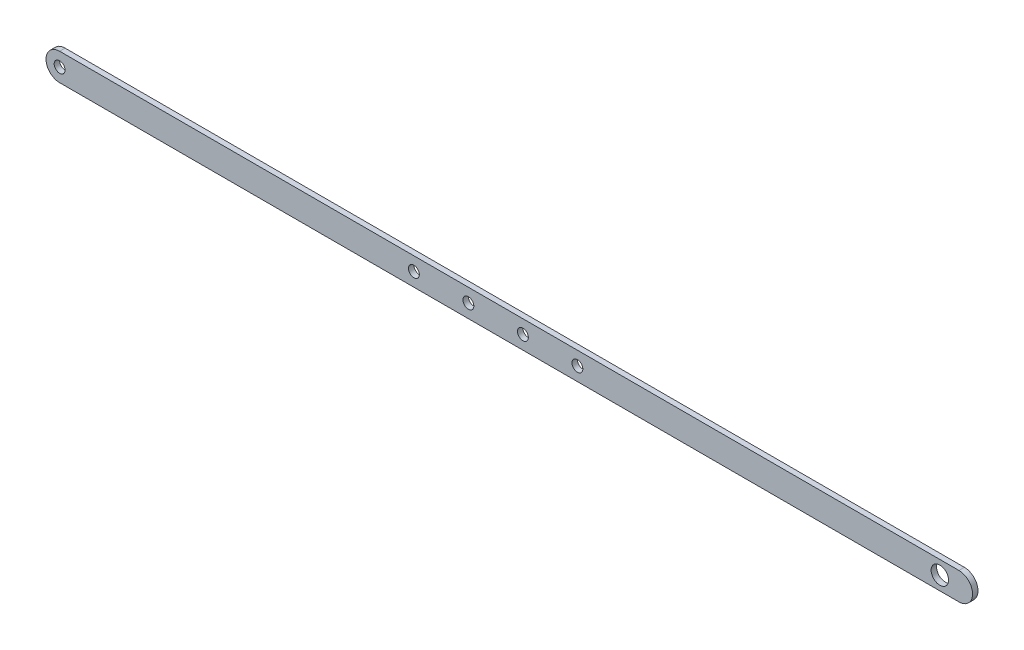
ISO-10303-21;
HEADER;
FILE_DESCRIPTION(('STEP AP214'),'2;1');
FILE_NAME('part.step','',(''),(''),'','','');
FILE_SCHEMA(('AUTOMOTIVE_DESIGN { 1 0 10303 214 1 1 1 1 }'));
ENDSEC;
DATA;
#1=APPLICATION_CONTEXT('core data for automotive mechanical design processes');
#2=APPLICATION_PROTOCOL_DEFINITION('international standard','automotive_design',2000,#1);
#3=PRODUCT_CONTEXT('',#1,'mechanical');
#4=PRODUCT('Part','Part','',(#3));
#5=PRODUCT_RELATED_PRODUCT_CATEGORY('part','',(#4));
#6=PRODUCT_DEFINITION_FORMATION('','',#4);
#7=PRODUCT_DEFINITION_CONTEXT('part definition',#1,'design');
#8=PRODUCT_DEFINITION('design','',#6,#7);
#9=PRODUCT_DEFINITION_SHAPE('','',#8);
#10=(LENGTH_UNIT() NAMED_UNIT(*) SI_UNIT(.MILLI.,.METRE.));
#11=(NAMED_UNIT(*) PLANE_ANGLE_UNIT() SI_UNIT($,.RADIAN.));
#12=(NAMED_UNIT(*) SI_UNIT($,.STERADIAN.) SOLID_ANGLE_UNIT());
#13=UNCERTAINTY_MEASURE_WITH_UNIT(LENGTH_MEASURE(1.E-05),#10,'distance_accuracy_value','');
#14=(GEOMETRIC_REPRESENTATION_CONTEXT(3) GLOBAL_UNCERTAINTY_ASSIGNED_CONTEXT((#13)) GLOBAL_UNIT_ASSIGNED_CONTEXT((#10,
#11,#12)) REPRESENTATION_CONTEXT('',''));
#15=CARTESIAN_POINT('',(0.,0.,0.));
#16=DIRECTION('',(0.,0.,1.));
#17=DIRECTION('',(1.,0.,0.));
#18=AXIS2_PLACEMENT_3D('',#15,#16,#17);
#19=CARTESIAN_POINT('',(0.,0.,2.));
#20=DIRECTION('',(0.,0.,-1.));
#21=DIRECTION('',(-1.,0.,0.));
#22=AXIS2_PLACEMENT_3D('',#19,#20,#21);
#23=CYLINDRICAL_SURFACE('',#22,5.);
#24=CARTESIAN_POINT('',(0.,0.,0.));
#25=DIRECTION('',(0.,0.,1.));
#26=DIRECTION('',(1.,0.,0.));
#27=AXIS2_PLACEMENT_3D('',#24,#25,#26);
#28=CIRCLE('',#27,5.);
#29=CARTESIAN_POINT('',(0.,5.,0.));
#30=VERTEX_POINT('',#29);
#31=CARTESIAN_POINT('',(0.,-5.,0.));
#32=VERTEX_POINT('',#31);
#33=EDGE_CURVE('E99',#30,#32,#28,.T.);
#34=ORIENTED_EDGE('',*,*,#33,.T.);
#35=DIRECTION('',(0.,0.,-1.));
#36=VECTOR('',#35,1.);
#37=CARTESIAN_POINT('',(0.,-5.,2.));
#38=LINE('',#37,#36);
#39=CARTESIAN_POINT('',(0.,-5.,2.));
#40=VERTEX_POINT('',#39);
#41=EDGE_CURVE('E11',#40,#32,#38,.T.);
#42=ORIENTED_EDGE('',*,*,#41,.F.);
#43=CARTESIAN_POINT('',(0.,0.,2.));
#44=DIRECTION('',(0.,0.,1.));
#45=DIRECTION('',(1.,0.,0.));
#46=AXIS2_PLACEMENT_3D('',#43,#44,#45);
#47=CIRCLE('',#46,5.);
#48=CARTESIAN_POINT('',(0.,5.,2.));
#49=VERTEX_POINT('',#48);
#50=EDGE_CURVE('E87',#49,#40,#47,.T.);
#51=ORIENTED_EDGE('',*,*,#50,.F.);
#52=DIRECTION('',(0.,0.,-1.));
#53=VECTOR('',#52,1.);
#54=CARTESIAN_POINT('',(0.,5.,2.));
#55=LINE('',#54,#53);
#56=EDGE_CURVE('E95',#49,#30,#55,.T.);
#57=ORIENTED_EDGE('',*,*,#56,.T.);
#58=EDGE_LOOP('',(#34,#42,#51,#57));
#59=FACE_BOUND('',#58,.T.);
#60=ADVANCED_FACE('F36',(#59),#23,.T.);
#61=CARTESIAN_POINT('',(0.,-5.,2.));
#62=DIRECTION('',(0.,1.,0.));
#63=DIRECTION('',(0.,0.,1.));
#64=AXIS2_PLACEMENT_3D('',#61,#62,#63);
#65=PLANE('',#64);
#66=DIRECTION('',(1.,0.,0.));
#67=VECTOR('',#66,1.);
#68=CARTESIAN_POINT('',(0.,-5.,0.));
#69=LINE('',#68,#67);
#70=CARTESIAN_POINT('',(330.,-5.,0.));
#71=VERTEX_POINT('',#70);
#72=EDGE_CURVE('E91',#32,#71,#69,.T.);
#73=ORIENTED_EDGE('',*,*,#72,.T.);
#74=DIRECTION('',(0.,0.,-1.));
#75=VECTOR('',#74,1.);
#76=CARTESIAN_POINT('',(330.,-5.,2.));
#77=LINE('',#76,#75);
#78=CARTESIAN_POINT('',(330.,-5.,2.));
#79=VERTEX_POINT('',#78);
#80=EDGE_CURVE('E44',#79,#71,#77,.T.);
#81=ORIENTED_EDGE('',*,*,#80,.F.);
#82=DIRECTION('',(1.,0.,0.));
#83=VECTOR('',#82,1.);
#84=CARTESIAN_POINT('',(0.,-5.,2.));
#85=LINE('',#84,#83);
#86=EDGE_CURVE('E82',#40,#79,#85,.T.);
#87=ORIENTED_EDGE('',*,*,#86,.F.);
#88=ORIENTED_EDGE('',*,*,#41,.T.);
#89=EDGE_LOOP('',(#73,#81,#87,#88));
#90=FACE_BOUND('',#89,.T.);
#91=ADVANCED_FACE('F90',(#90),#65,.F.);
#92=CARTESIAN_POINT('',(330.,0.,2.));
#93=DIRECTION('',(0.,0.,-1.));
#94=DIRECTION('',(-1.,0.,0.));
#95=AXIS2_PLACEMENT_3D('',#92,#93,#94);
#96=CYLINDRICAL_SURFACE('',#95,5.);
#97=CARTESIAN_POINT('',(330.,0.,0.));
#98=DIRECTION('',(0.,0.,1.));
#99=DIRECTION('',(1.,0.,0.));
#100=AXIS2_PLACEMENT_3D('',#97,#98,#99);
#101=CIRCLE('',#100,5.);
#102=CARTESIAN_POINT('',(330.,5.,0.));
#103=VERTEX_POINT('',#102);
#104=EDGE_CURVE('E69',#71,#103,#101,.T.);
#105=ORIENTED_EDGE('',*,*,#104,.T.);
#106=DIRECTION('',(0.,0.,-1.));
#107=VECTOR('',#106,1.);
#108=CARTESIAN_POINT('',(330.,5.,2.));
#109=LINE('',#108,#107);
#110=CARTESIAN_POINT('',(330.,5.,2.));
#111=VERTEX_POINT('',#110);
#112=EDGE_CURVE('E92',#111,#103,#109,.T.);
#113=ORIENTED_EDGE('',*,*,#112,.F.);
#114=CARTESIAN_POINT('',(330.,0.,2.));
#115=DIRECTION('',(0.,0.,1.));
#116=DIRECTION('',(1.,0.,0.));
#117=AXIS2_PLACEMENT_3D('',#114,#115,#116);
#118=CIRCLE('',#117,5.);
#119=EDGE_CURVE('E85',#79,#111,#118,.T.);
#120=ORIENTED_EDGE('',*,*,#119,.F.);
#121=ORIENTED_EDGE('',*,*,#80,.T.);
#122=EDGE_LOOP('',(#105,#113,#120,#121));
#123=FACE_BOUND('',#122,.T.);
#124=ADVANCED_FACE('F93',(#123),#96,.T.);
#125=CARTESIAN_POINT('',(0.,5.,2.));
#126=DIRECTION('',(0.,-1.,0.));
#127=DIRECTION('',(0.,0.,-1.));
#128=AXIS2_PLACEMENT_3D('',#125,#126,#127);
#129=PLANE('',#128);
#130=DIRECTION('',(-1.,0.,0.));
#131=VECTOR('',#130,1.);
#132=CARTESIAN_POINT('',(0.,5.,0.));
#133=LINE('',#132,#131);
#134=EDGE_CURVE('E75',#103,#30,#133,.T.);
#135=ORIENTED_EDGE('',*,*,#134,.T.);
#136=ORIENTED_EDGE('',*,*,#56,.F.);
#137=DIRECTION('',(-1.,0.,0.));
#138=VECTOR('',#137,1.);
#139=CARTESIAN_POINT('',(0.,5.,2.));
#140=LINE('',#139,#138);
#141=EDGE_CURVE('E52',#111,#49,#140,.T.);
#142=ORIENTED_EDGE('',*,*,#141,.F.);
#143=ORIENTED_EDGE('',*,*,#112,.T.);
#144=EDGE_LOOP('',(#135,#136,#142,#143));
#145=FACE_BOUND('',#144,.T.);
#146=ADVANCED_FACE('F107',(#145),#129,.F.);
#147=CARTESIAN_POINT('',(0.,0.,2.));
#148=DIRECTION('',(0.,0.,1.));
#149=DIRECTION('',(1.,0.,0.));
#150=AXIS2_PLACEMENT_3D('',#147,#148,#149);
#151=PLANE('',#150);
#152=CARTESIAN_POINT('',(0.,0.,2.));
#153=DIRECTION('',(0.,0.,1.));
#154=DIRECTION('',(1.,0.,0.));
#155=AXIS2_PLACEMENT_3D('',#152,#153,#154);
#156=CIRCLE('',#155,2.);
#157=CARTESIAN_POINT('',(2.,0.,2.));
#158=VERTEX_POINT('',#157);
#159=EDGE_CURVE('E145',#158,#158,#156,.T.);
#160=ORIENTED_EDGE('',*,*,#159,.F.);
#161=EDGE_LOOP('',(#160));
#162=FACE_BOUND('',#161,.T.);
#163=CARTESIAN_POINT('',(170.,-1.38249790729494E-13,2.));
#164=DIRECTION('',(0.,0.,1.));
#165=DIRECTION('',(1.,0.,0.));
#166=AXIS2_PLACEMENT_3D('',#163,#164,#165);
#167=CIRCLE('',#166,2.);
#168=CARTESIAN_POINT('',(172.,-1.38249790729494E-13,2.));
#169=VERTEX_POINT('',#168);
#170=EDGE_CURVE('E136',#169,#169,#167,.T.);
#171=ORIENTED_EDGE('',*,*,#170,.F.);
#172=EDGE_LOOP('',(#171));
#173=FACE_BOUND('',#172,.T.);
#174=CARTESIAN_POINT('',(150.,-2.77909044283219E-13,2.));
#175=DIRECTION('',(0.,0.,1.));
#176=DIRECTION('',(1.,0.,0.));
#177=AXIS2_PLACEMENT_3D('',#174,#175,#176);
#178=CIRCLE('',#177,2.);
#179=CARTESIAN_POINT('',(152.,-2.77909044283219E-13,2.));
#180=VERTEX_POINT('',#179);
#181=EDGE_CURVE('E128',#180,#180,#178,.T.);
#182=ORIENTED_EDGE('',*,*,#181,.F.);
#183=EDGE_LOOP('',(#182));
#184=FACE_BOUND('',#183,.T.);
#185=CARTESIAN_POINT('',(130.,-4.17568297836945E-13,2.));
#186=DIRECTION('',(0.,0.,1.));
#187=DIRECTION('',(1.,0.,0.));
#188=AXIS2_PLACEMENT_3D('',#185,#186,#187);
#189=CIRCLE('',#188,2.);
#190=CARTESIAN_POINT('',(132.,-4.17568297836945E-13,2.));
#191=VERTEX_POINT('',#190);
#192=EDGE_CURVE('E129',#191,#191,#189,.T.);
#193=ORIENTED_EDGE('',*,*,#192,.F.);
#194=EDGE_LOOP('',(#193));
#195=FACE_BOUND('',#194,.T.);
#196=CARTESIAN_POINT('',(190.,0.,2.));
#197=DIRECTION('',(0.,0.,1.));
#198=DIRECTION('',(1.,0.,0.));
#199=AXIS2_PLACEMENT_3D('',#196,#197,#198);
#200=CIRCLE('',#199,2.);
#201=CARTESIAN_POINT('',(192.,0.,2.));
#202=VERTEX_POINT('',#201);
#203=EDGE_CURVE('E121',#202,#202,#200,.T.);
#204=ORIENTED_EDGE('',*,*,#203,.F.);
#205=EDGE_LOOP('',(#204));
#206=FACE_BOUND('',#205,.T.);
#207=CARTESIAN_POINT('',(323.,0.,2.));
#208=DIRECTION('',(0.,0.,1.));
#209=DIRECTION('',(1.,0.,0.));
#210=AXIS2_PLACEMENT_3D('',#207,#208,#209);
#211=CIRCLE('',#210,3.19999999999998);
#212=CARTESIAN_POINT('',(326.2,0.,2.));
#213=VERTEX_POINT('',#212);
#214=EDGE_CURVE('E115',#213,#213,#211,.T.);
#215=ORIENTED_EDGE('',*,*,#214,.F.);
#216=EDGE_LOOP('',(#215));
#217=FACE_BOUND('',#216,.T.);
#218=ORIENTED_EDGE('',*,*,#50,.T.);
#219=ORIENTED_EDGE('',*,*,#86,.T.);
#220=ORIENTED_EDGE('',*,*,#119,.T.);
#221=ORIENTED_EDGE('',*,*,#141,.T.);
#222=EDGE_LOOP('',(#218,#219,#220,#221));
#223=FACE_BOUND('',#222,.T.);
#224=ADVANCED_FACE('F83',(#162,#173,#184,#195,#206,#217,#223),#151,.T.);
#225=CARTESIAN_POINT('',(0.,0.,0.));
#226=DIRECTION('',(0.,0.,1.));
#227=DIRECTION('',(1.,0.,0.));
#228=AXIS2_PLACEMENT_3D('',#225,#226,#227);
#229=PLANE('',#228);
#230=CARTESIAN_POINT('',(0.,0.,0.));
#231=DIRECTION('',(0.,0.,1.));
#232=DIRECTION('',(1.,0.,0.));
#233=AXIS2_PLACEMENT_3D('',#230,#231,#232);
#234=CIRCLE('',#233,2.);
#235=CARTESIAN_POINT('',(2.,0.,0.));
#236=VERTEX_POINT('',#235);
#237=EDGE_CURVE('E132',#236,#236,#234,.F.);
#238=ORIENTED_EDGE('',*,*,#237,.F.);
#239=EDGE_LOOP('',(#238));
#240=FACE_BOUND('',#239,.T.);
#241=CARTESIAN_POINT('',(170.,-1.38249790729494E-13,0.));
#242=DIRECTION('',(0.,0.,1.));
#243=DIRECTION('',(1.,0.,0.));
#244=AXIS2_PLACEMENT_3D('',#241,#242,#243);
#245=CIRCLE('',#244,2.);
#246=CARTESIAN_POINT('',(172.,-1.38249790729494E-13,0.));
#247=VERTEX_POINT('',#246);
#248=EDGE_CURVE('E124',#247,#247,#245,.F.);
#249=ORIENTED_EDGE('',*,*,#248,.F.);
#250=EDGE_LOOP('',(#249));
#251=FACE_BOUND('',#250,.T.);
#252=CARTESIAN_POINT('',(150.,-2.77909044283219E-13,0.));
#253=DIRECTION('',(0.,0.,1.));
#254=DIRECTION('',(1.,0.,0.));
#255=AXIS2_PLACEMENT_3D('',#252,#253,#254);
#256=CIRCLE('',#255,2.);
#257=CARTESIAN_POINT('',(152.,-2.77909044283219E-13,0.));
#258=VERTEX_POINT('',#257);
#259=EDGE_CURVE('E133',#258,#258,#256,.F.);
#260=ORIENTED_EDGE('',*,*,#259,.F.);
#261=EDGE_LOOP('',(#260));
#262=FACE_BOUND('',#261,.T.);
#263=CARTESIAN_POINT('',(130.,-4.17568297836945E-13,0.));
#264=DIRECTION('',(0.,0.,1.));
#265=DIRECTION('',(1.,0.,0.));
#266=AXIS2_PLACEMENT_3D('',#263,#264,#265);
#267=CIRCLE('',#266,2.);
#268=CARTESIAN_POINT('',(132.,-4.17568297836945E-13,0.));
#269=VERTEX_POINT('',#268);
#270=EDGE_CURVE('E125',#269,#269,#267,.F.);
#271=ORIENTED_EDGE('',*,*,#270,.F.);
#272=EDGE_LOOP('',(#271));
#273=FACE_BOUND('',#272,.T.);
#274=CARTESIAN_POINT('',(190.,0.,0.));
#275=DIRECTION('',(0.,0.,1.));
#276=DIRECTION('',(1.,0.,0.));
#277=AXIS2_PLACEMENT_3D('',#274,#275,#276);
#278=CIRCLE('',#277,2.);
#279=CARTESIAN_POINT('',(192.,0.,0.));
#280=VERTEX_POINT('',#279);
#281=EDGE_CURVE('E118',#280,#280,#278,.F.);
#282=ORIENTED_EDGE('',*,*,#281,.F.);
#283=EDGE_LOOP('',(#282));
#284=FACE_BOUND('',#283,.T.);
#285=CARTESIAN_POINT('',(323.,0.,0.));
#286=DIRECTION('',(0.,0.,1.));
#287=DIRECTION('',(1.,0.,0.));
#288=AXIS2_PLACEMENT_3D('',#285,#286,#287);
#289=CIRCLE('',#288,3.19999999999998);
#290=CARTESIAN_POINT('',(326.2,0.,0.));
#291=VERTEX_POINT('',#290);
#292=EDGE_CURVE('E102',#291,#291,#289,.F.);
#293=ORIENTED_EDGE('',*,*,#292,.F.);
#294=EDGE_LOOP('',(#293));
#295=FACE_BOUND('',#294,.T.);
#296=ORIENTED_EDGE('',*,*,#33,.F.);
#297=ORIENTED_EDGE('',*,*,#134,.F.);
#298=ORIENTED_EDGE('',*,*,#104,.F.);
#299=ORIENTED_EDGE('',*,*,#72,.F.);
#300=EDGE_LOOP('',(#296,#297,#298,#299));
#301=FACE_BOUND('',#300,.T.);
#302=ADVANCED_FACE('F110',(#240,#251,#262,#273,#284,#295,#301),#229,.F.);
#303=CARTESIAN_POINT('',(323.,0.,-9.05096679918776));
#304=DIRECTION('',(0.,0.,1.));
#305=DIRECTION('',(1.,0.,0.));
#306=AXIS2_PLACEMENT_3D('',#303,#304,#305);
#307=CYLINDRICAL_SURFACE('',#306,3.19999999999998);
#308=ORIENTED_EDGE('',*,*,#292,.T.);
#309=EDGE_LOOP('',(#308));
#310=FACE_BOUND('',#309,.T.);
#311=ORIENTED_EDGE('',*,*,#214,.T.);
#312=EDGE_LOOP('',(#311));
#313=FACE_BOUND('',#312,.T.);
#314=ADVANCED_FACE('F164',(#310,#313),#307,.F.);
#315=CARTESIAN_POINT('',(190.,0.,-5.65685424949238));
#316=DIRECTION('',(0.,0.,1.));
#317=DIRECTION('',(1.,0.,0.));
#318=AXIS2_PLACEMENT_3D('',#315,#316,#317);
#319=CYLINDRICAL_SURFACE('',#318,2.);
#320=ORIENTED_EDGE('',*,*,#281,.T.);
#321=EDGE_LOOP('',(#320));
#322=FACE_BOUND('',#321,.T.);
#323=ORIENTED_EDGE('',*,*,#203,.T.);
#324=EDGE_LOOP('',(#323));
#325=FACE_BOUND('',#324,.T.);
#326=ADVANCED_FACE('F166',(#322,#325),#319,.F.);
#327=CARTESIAN_POINT('',(130.,-4.17568297836945E-13,-5.65685424949238));
#328=DIRECTION('',(0.,0.,1.));
#329=DIRECTION('',(1.,0.,0.));
#330=AXIS2_PLACEMENT_3D('',#327,#328,#329);
#331=CYLINDRICAL_SURFACE('',#330,2.);
#332=ORIENTED_EDGE('',*,*,#270,.T.);
#333=EDGE_LOOP('',(#332));
#334=FACE_BOUND('',#333,.T.);
#335=ORIENTED_EDGE('',*,*,#192,.T.);
#336=EDGE_LOOP('',(#335));
#337=FACE_BOUND('',#336,.T.);
#338=ADVANCED_FACE('F173',(#334,#337),#331,.F.);
#339=CARTESIAN_POINT('',(150.,-2.77909044283219E-13,-5.65685424949238));
#340=DIRECTION('',(0.,0.,1.));
#341=DIRECTION('',(1.,0.,0.));
#342=AXIS2_PLACEMENT_3D('',#339,#340,#341);
#343=CYLINDRICAL_SURFACE('',#342,2.);
#344=ORIENTED_EDGE('',*,*,#259,.T.);
#345=EDGE_LOOP('',(#344));
#346=FACE_BOUND('',#345,.T.);
#347=ORIENTED_EDGE('',*,*,#181,.T.);
#348=EDGE_LOOP('',(#347));
#349=FACE_BOUND('',#348,.T.);
#350=ADVANCED_FACE('F220',(#346,#349),#343,.F.);
#351=CARTESIAN_POINT('',(170.,-1.38249790729494E-13,-5.65685424949238));
#352=DIRECTION('',(0.,0.,1.));
#353=DIRECTION('',(1.,0.,0.));
#354=AXIS2_PLACEMENT_3D('',#351,#352,#353);
#355=CYLINDRICAL_SURFACE('',#354,2.);
#356=ORIENTED_EDGE('',*,*,#248,.T.);
#357=EDGE_LOOP('',(#356));
#358=FACE_BOUND('',#357,.T.);
#359=ORIENTED_EDGE('',*,*,#170,.T.);
#360=EDGE_LOOP('',(#359));
#361=FACE_BOUND('',#360,.T.);
#362=ADVANCED_FACE('F210',(#358,#361),#355,.F.);
#363=CARTESIAN_POINT('',(0.,0.,-5.65685424949238));
#364=DIRECTION('',(0.,0.,1.));
#365=DIRECTION('',(1.,0.,0.));
#366=AXIS2_PLACEMENT_3D('',#363,#364,#365);
#367=CYLINDRICAL_SURFACE('',#366,2.);
#368=ORIENTED_EDGE('',*,*,#237,.T.);
#369=EDGE_LOOP('',(#368));
#370=FACE_BOUND('',#369,.T.);
#371=ORIENTED_EDGE('',*,*,#159,.T.);
#372=EDGE_LOOP('',(#371));
#373=FACE_BOUND('',#372,.T.);
#374=ADVANCED_FACE('F149',(#370,#373),#367,.F.);
#375=CLOSED_SHELL('',(#60,#91,#124,#146,#224,#302,#314,#326,#338,#350,#362,#374));
#376=MANIFOLD_SOLID_BREP('B2',#375);
#377=ADVANCED_BREP_SHAPE_REPRESENTATION('',(#18,#376),#14);
#378=SHAPE_DEFINITION_REPRESENTATION(#9,#377);
ENDSEC;
END-ISO-10303-21;
